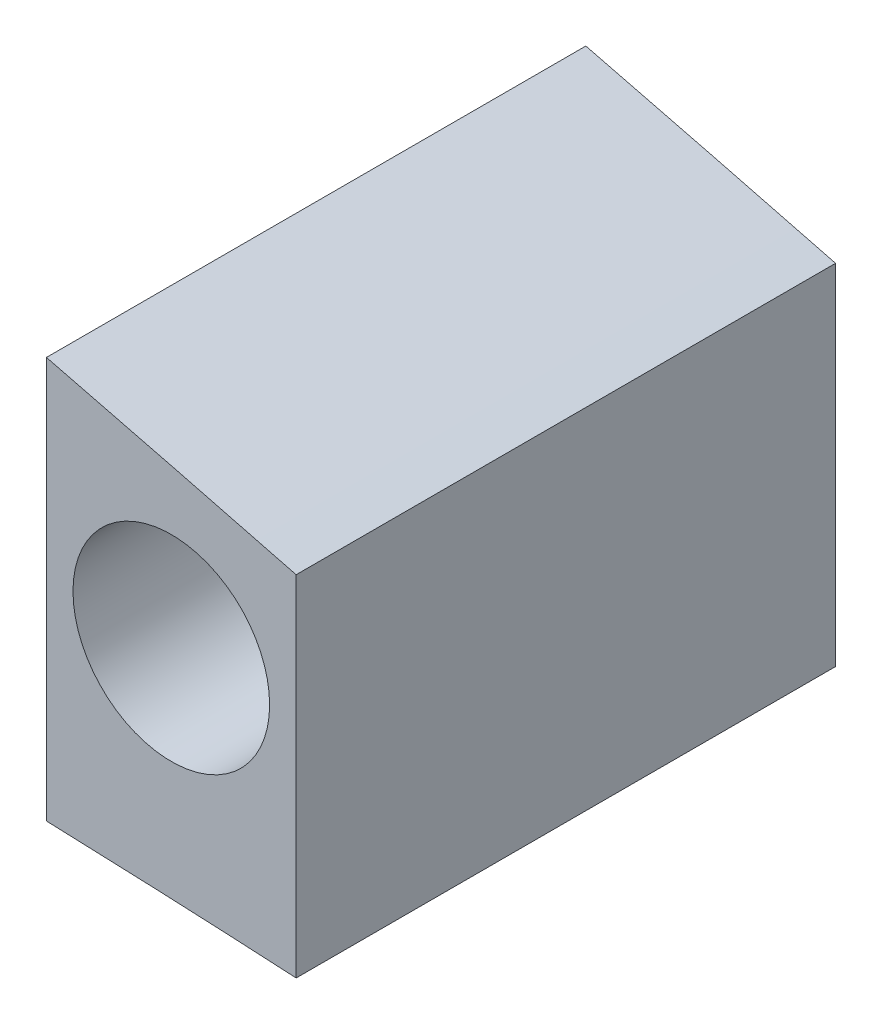
ISO-10303-21;
HEADER;
FILE_DESCRIPTION(('STEP AP214'),'2;1');
FILE_NAME('part.step','',(''),(''),'','','');
FILE_SCHEMA(('AUTOMOTIVE_DESIGN { 1 0 10303 214 1 1 1 1 }'));
ENDSEC;
DATA;
#1=APPLICATION_CONTEXT('core data for automotive mechanical design processes');
#2=APPLICATION_PROTOCOL_DEFINITION('international standard','automotive_design',2000,#1);
#3=PRODUCT_CONTEXT('',#1,'mechanical');
#4=PRODUCT('Part','Part','',(#3));
#5=PRODUCT_RELATED_PRODUCT_CATEGORY('part','',(#4));
#6=PRODUCT_DEFINITION_FORMATION('','',#4);
#7=PRODUCT_DEFINITION_CONTEXT('part definition',#1,'design');
#8=PRODUCT_DEFINITION('design','',#6,#7);
#9=PRODUCT_DEFINITION_SHAPE('','',#8);
#10=(LENGTH_UNIT() NAMED_UNIT(*) SI_UNIT(.MILLI.,.METRE.));
#11=(NAMED_UNIT(*) PLANE_ANGLE_UNIT() SI_UNIT($,.RADIAN.));
#12=(NAMED_UNIT(*) SI_UNIT($,.STERADIAN.) SOLID_ANGLE_UNIT());
#13=UNCERTAINTY_MEASURE_WITH_UNIT(LENGTH_MEASURE(1.E-05),#10,'distance_accuracy_value','');
#14=(GEOMETRIC_REPRESENTATION_CONTEXT(3) GLOBAL_UNCERTAINTY_ASSIGNED_CONTEXT((#13)) GLOBAL_UNIT_ASSIGNED_CONTEXT((#10,
#11,#12)) REPRESENTATION_CONTEXT('',''));
#15=CARTESIAN_POINT('',(0.,0.,0.));
#16=DIRECTION('',(0.,0.,1.));
#17=DIRECTION('',(1.,0.,0.));
#18=AXIS2_PLACEMENT_3D('',#15,#16,#17);
#19=CARTESIAN_POINT('',(0.000560351162113587,0.000130087070423624,27.432));
#20=CARTESIAN_POINT('',(1.23071418869678,-6.92407609127206,27.432));
#21=CARTESIAN_POINT('',(15.3166033306834,-6.18906584099094,27.432));
#22=CARTESIAN_POINT('',(36.4546728163185,-6.09849990105009,27.432));
#23=CARTESIAN_POINT('',(66.5061971849192,-0.586669106973501,27.432));
#24=CARTESIAN_POINT('',(110.497331171581,6.18149522271792,27.432));
#25=CARTESIAN_POINT('',(157.718638091679,9.03065014873911,27.432));
#26=CARTESIAN_POINT('',(205.10142463584,8.83808028186313,27.432));
#27=CARTESIAN_POINT('',(235.858814759408,7.87030619247826,27.432));
#28=CARTESIAN_POINT('',(260.846344817159,5.42741339404395,27.432));
#29=CARTESIAN_POINT('',(276.264022989737,4.51435670375389,27.432));
#30=CARTESIAN_POINT('',(293.989507544058,2.09398731346533,27.432));
#31=CARTESIAN_POINT('',(303.956832564589,1.47095520994628,27.432));
#32=CARTESIAN_POINT('',(309.846313894505,0.000130087070423666,27.432));
#33=B_SPLINE_CURVE_WITH_KNOTS('',3,(#19,#20,#21,#22,#23,#24,#25,#26,#27,#28,#29,#30,#31,#32),
.UNSPECIFIED.,.F.,.F.,(4,1,1,1,1,1,1,1,1,1,1,4),(0.,0.0569078595717698,0.106482711504673,
0.214488052979465,0.341297688349143,0.535095665520157,0.664680853556909,0.794660698192775,
0.828978881532905,0.904725108725214,0.942212919019968,1.),.UNSPECIFIED.);
#34=DIRECTION('',(0.,0.,-1.));
#35=VECTOR('',#34,1.);
#36=SURFACE_OF_LINEAR_EXTRUSION('',#33,#35);
#37=CARTESIAN_POINT('',(220.946313894505,8.2551988143819,27.432));
#38=VERTEX_POINT('',#37);
#39=CARTESIAN_POINT('',(233.646313894505,7.69052977146896,27.432));
#40=VERTEX_POINT('',#39);
#41=EDGE_CURVE('E86',#38,#40,#33,.T.);
#42=ORIENTED_EDGE('',*,*,#41,.F.);
#43=DIRECTION('',(0.,0.,-1.));
#44=VECTOR('',#43,1.);
#45=CARTESIAN_POINT('',(220.946313894505,8.25519881439546,27.432));
#46=LINE('',#45,#44);
#47=CARTESIAN_POINT('',(220.946313894505,8.2551988143819,0.));
#48=VERTEX_POINT('',#47);
#49=EDGE_CURVE('E74',#38,#48,#46,.T.);
#50=ORIENTED_EDGE('',*,*,#49,.T.);
#51=CARTESIAN_POINT('',(0.000560351162113587,0.000130087070423624,0.));
#52=CARTESIAN_POINT('',(1.23071418869678,-6.92407609127206,0.));
#53=CARTESIAN_POINT('',(15.3166033306834,-6.18906584099094,0.));
#54=CARTESIAN_POINT('',(36.4546728163185,-6.09849990105009,0.));
#55=CARTESIAN_POINT('',(66.5061971849192,-0.586669106973501,0.));
#56=CARTESIAN_POINT('',(110.497331171581,6.18149522271792,0.));
#57=CARTESIAN_POINT('',(157.718638091679,9.03065014873911,0.));
#58=CARTESIAN_POINT('',(205.10142463584,8.83808028186313,0.));
#59=CARTESIAN_POINT('',(235.858814759408,7.87030619247826,0.));
#60=CARTESIAN_POINT('',(260.846344817159,5.42741339404395,0.));
#61=CARTESIAN_POINT('',(276.264022989737,4.51435670375389,0.));
#62=CARTESIAN_POINT('',(293.989507544058,2.09398731346533,0.));
#63=CARTESIAN_POINT('',(303.956832564589,1.47095520994628,0.));
#64=CARTESIAN_POINT('',(309.846313894505,0.000130087070423666,0.));
#65=B_SPLINE_CURVE_WITH_KNOTS('',3,(#51,#52,#53,#54,#55,#56,#57,#58,#59,#60,#61,#62,#63,#64),
.UNSPECIFIED.,.F.,.F.,(4,1,1,1,1,1,1,1,1,1,1,4),(0.,0.0569078595717698,0.106482711504673,
0.214488052979465,0.341297688349143,0.535095665520157,0.664680853556909,0.794660698192775,
0.828978881532905,0.904725108725214,0.942212919019968,1.),.UNSPECIFIED.);
#66=CARTESIAN_POINT('',(233.646313884782,7.69052977146896,0.));
#67=VERTEX_POINT('',#66);
#68=EDGE_CURVE('E58',#48,#67,#65,.T.);
#69=ORIENTED_EDGE('',*,*,#68,.T.);
#70=DIRECTION('',(0.,0.,-1.));
#71=VECTOR('',#70,1.);
#72=CARTESIAN_POINT('',(233.646313894505,7.69052977092525,27.432));
#73=LINE('',#72,#71);
#74=EDGE_CURVE('E90',#67,#40,#73,.F.);
#75=ORIENTED_EDGE('',*,*,#74,.T.);
#76=EDGE_LOOP('',(#42,#50,#69,#75));
#77=FACE_BOUND('',#76,.T.);
#78=ADVANCED_FACE('F35',(#77),#36,.F.);
#79=CARTESIAN_POINT('',(309.846313894505,0.000130087070423864,27.432));
#80=CARTESIAN_POINT('',(314.816918223261,-0.51620674157964,27.432));
#81=CARTESIAN_POINT('',(301.273197720551,4.38282813873556,27.432));
#82=CARTESIAN_POINT('',(290.359837670022,8.71099439045776,27.432));
#83=CARTESIAN_POINT('',(256.952064400645,19.5289209482833,27.432));
#84=CARTESIAN_POINT('',(217.961060472083,29.6129748944238,27.432));
#85=CARTESIAN_POINT('',(173.256699242147,40.0411042779434,27.432));
#86=CARTESIAN_POINT('',(131.400792108858,47.8848319151037,27.432));
#87=CARTESIAN_POINT('',(89.5976184754884,49.290763053775,27.432));
#88=CARTESIAN_POINT('',(52.1111282710831,42.0692152748914,27.432));
#89=CARTESIAN_POINT('',(26.2867198183782,29.9751763284633,27.432));
#90=CARTESIAN_POINT('',(8.64909202481883,17.8566051741579,27.432));
#91=CARTESIAN_POINT('',(0.810633126632263,7.35919605469637,27.432));
#92=CARTESIAN_POINT('',(0.000560351162116727,0.000130087070423829,27.432));
#93=B_SPLINE_CURVE_WITH_KNOTS('',3,(#79,#80,#81,#82,#83,#84,#85,#86,#87,#88,#89,#90,#91,#92),
.UNSPECIFIED.,.F.,.F.,(4,1,1,1,1,1,1,1,1,1,1,4),(0.,0.0239417713693992,0.070244030177139,
0.147561721425381,0.308455887006792,0.442387865106874,0.551517565626309,0.687091076796298,
0.811391258419108,0.886311735305172,0.939136382225768,1.),.UNSPECIFIED.);
#94=DIRECTION('',(0.,0.,-1.));
#95=VECTOR('',#94,1.);
#96=SURFACE_OF_LINEAR_EXTRUSION('',#93,#95);
#97=CARTESIAN_POINT('',(309.846313894505,0.000130087070423864,0.));
#98=CARTESIAN_POINT('',(314.816918223261,-0.51620674157964,0.));
#99=CARTESIAN_POINT('',(301.273197720551,4.38282813873556,0.));
#100=CARTESIAN_POINT('',(290.359837670022,8.71099439045776,0.));
#101=CARTESIAN_POINT('',(256.952064400645,19.5289209482833,0.));
#102=CARTESIAN_POINT('',(217.961060472083,29.6129748944238,0.));
#103=CARTESIAN_POINT('',(173.256699242147,40.0411042779434,0.));
#104=CARTESIAN_POINT('',(131.400792108858,47.8848319151037,0.));
#105=CARTESIAN_POINT('',(89.5976184754884,49.290763053775,0.));
#106=CARTESIAN_POINT('',(52.1111282710831,42.0692152748914,0.));
#107=CARTESIAN_POINT('',(26.2867198183782,29.9751763284633,0.));
#108=CARTESIAN_POINT('',(8.64909202481883,17.8566051741579,0.));
#109=CARTESIAN_POINT('',(0.810633126632263,7.35919605469637,0.));
#110=CARTESIAN_POINT('',(0.000560351162116727,0.000130087070423829,0.));
#111=B_SPLINE_CURVE_WITH_KNOTS('',3,(#97,#98,#99,#100,#101,#102,#103,#104,#105,#106,#107,#108,
#109,#110),.UNSPECIFIED.,.F.,.F.,(4,1,1,1,1,1,1,1,1,1,1,4),(0.,0.0239417713693992,
0.070244030177139,0.147561721425381,0.308455887006792,0.442387865106874,0.551517565626309,
0.687091076796298,0.811391258419108,0.886311735305172,0.939136382225768,1.),.UNSPECIFIED.);
#112=CARTESIAN_POINT('',(233.646313894505,25.4527523915985,0.));
#113=VERTEX_POINT('',#112);
#114=CARTESIAN_POINT('',(220.946313894505,28.6725157585964,0.));
#115=VERTEX_POINT('',#114);
#116=EDGE_CURVE('E91',#113,#115,#111,.T.);
#117=ORIENTED_EDGE('',*,*,#116,.T.);
#118=DIRECTION('',(0.,0.,-1.));
#119=VECTOR('',#118,1.);
#120=CARTESIAN_POINT('',(220.946313894505,28.6725157585964,27.432));
#121=LINE('',#120,#119);
#122=CARTESIAN_POINT('',(220.946313894505,28.6725157585964,27.432));
#123=VERTEX_POINT('',#122);
#124=EDGE_CURVE('E50',#115,#123,#121,.F.);
#125=ORIENTED_EDGE('',*,*,#124,.T.);
#126=CARTESIAN_POINT('',(233.646313894505,25.4527523915985,27.432));
#127=VERTEX_POINT('',#126);
#128=EDGE_CURVE('E43',#127,#123,#93,.T.);
#129=ORIENTED_EDGE('',*,*,#128,.F.);
#130=DIRECTION('',(0.,0.,-1.));
#131=VECTOR('',#130,1.);
#132=CARTESIAN_POINT('',(233.646313894505,25.4527523940641,27.432));
#133=LINE('',#132,#131);
#134=EDGE_CURVE('E182',#127,#113,#133,.T.);
#135=ORIENTED_EDGE('',*,*,#134,.T.);
#136=EDGE_LOOP('',(#117,#125,#129,#135));
#137=FACE_BOUND('',#136,.T.);
#138=ADVANCED_FACE('F111',(#137),#96,.F.);
#139=CARTESIAN_POINT('',(153.387816973495,8.33338198857885,27.432));
#140=DIRECTION('',(0.,0.,-1.));
#141=DIRECTION('',(-1.,0.,0.));
#142=AXIS2_PLACEMENT_3D('',#139,#140,#141);
#143=PLANE('',#142);
#144=CARTESIAN_POINT('',(227.296313894505,19.0501300870704,27.432));
#145=DIRECTION('',(0.,0.,1.));
#146=DIRECTION('',(1.,0.,0.));
#147=AXIS2_PLACEMENT_3D('',#144,#145,#146);
#148=CIRCLE('',#147,4.99999999999999);
#149=CARTESIAN_POINT('',(232.296313894505,19.0501300870704,27.432));
#150=VERTEX_POINT('',#149);
#151=EDGE_CURVE('E180',#150,#150,#148,.T.);
#152=ORIENTED_EDGE('',*,*,#151,.F.);
#153=EDGE_LOOP('',(#152));
#154=FACE_BOUND('',#153,.T.);
#155=ORIENTED_EDGE('',*,*,#128,.T.);
#156=DIRECTION('',(0.,1.,0.));
#157=VECTOR('',#156,1.);
#158=CARTESIAN_POINT('',(220.946313894505,80.4351700103236,27.432));
#159=LINE('',#158,#157);
#160=EDGE_CURVE('E77',#38,#123,#159,.T.);
#161=ORIENTED_EDGE('',*,*,#160,.F.);
#162=ORIENTED_EDGE('',*,*,#41,.T.);
#163=DIRECTION('',(0.,-1.,0.));
#164=VECTOR('',#163,1.);
#165=CARTESIAN_POINT('',(233.646313894505,-48.3468699505748,27.432));
#166=LINE('',#165,#164);
#167=EDGE_CURVE('E80',#127,#40,#166,.T.);
#168=ORIENTED_EDGE('',*,*,#167,.F.);
#169=EDGE_LOOP('',(#155,#161,#162,#168));
#170=FACE_BOUND('',#169,.T.);
#171=ADVANCED_FACE('F84',(#154,#170),#143,.F.);
#172=CARTESIAN_POINT('',(153.387816973495,8.33338198857885,0.));
#173=DIRECTION('',(0.,0.,-1.));
#174=DIRECTION('',(-1.,0.,0.));
#175=AXIS2_PLACEMENT_3D('',#172,#173,#174);
#176=PLANE('',#175);
#177=DIRECTION('',(0.,1.,0.));
#178=VECTOR('',#177,1.);
#179=CARTESIAN_POINT('',(220.946313894505,80.4351700103236,0.));
#180=LINE('',#179,#178);
#181=EDGE_CURVE('E78',#48,#115,#180,.T.);
#182=ORIENTED_EDGE('',*,*,#181,.T.);
#183=ORIENTED_EDGE('',*,*,#116,.F.);
#184=DIRECTION('',(0.,1.,0.));
#185=VECTOR('',#184,1.);
#186=CARTESIAN_POINT('',(233.646313894505,8.33338198857885,0.));
#187=LINE('',#186,#185);
#188=EDGE_CURVE('E11',#67,#113,#187,.T.);
#189=ORIENTED_EDGE('',*,*,#188,.F.);
#190=ORIENTED_EDGE('',*,*,#68,.F.);
#191=EDGE_LOOP('',(#182,#183,#189,#190));
#192=FACE_BOUND('',#191,.T.);
#193=CARTESIAN_POINT('',(227.296313894505,19.0501300870704,0.));
#194=DIRECTION('',(0.,0.,1.));
#195=DIRECTION('',(1.,0.,0.));
#196=AXIS2_PLACEMENT_3D('',#193,#194,#195);
#197=CIRCLE('',#196,4.99999999999999);
#198=CARTESIAN_POINT('',(232.296313894505,19.0501300870704,0.));
#199=VERTEX_POINT('',#198);
#200=EDGE_CURVE('E177',#199,#199,#197,.T.);
#201=ORIENTED_EDGE('',*,*,#200,.T.);
#202=EDGE_LOOP('',(#201));
#203=FACE_BOUND('',#202,.T.);
#204=ADVANCED_FACE('F115',(#192,#203),#176,.T.);
#205=CARTESIAN_POINT('',(233.646313894505,-48.3468699505748,0.));
#206=DIRECTION('',(-1.,0.,0.));
#207=DIRECTION('',(0.,0.,1.));
#208=AXIS2_PLACEMENT_3D('',#205,#206,#207);
#209=PLANE('',#208);
#210=ORIENTED_EDGE('',*,*,#188,.T.);
#211=ORIENTED_EDGE('',*,*,#134,.F.);
#212=ORIENTED_EDGE('',*,*,#167,.T.);
#213=ORIENTED_EDGE('',*,*,#74,.F.);
#214=EDGE_LOOP('',(#210,#211,#212,#213));
#215=FACE_BOUND('',#214,.T.);
#216=ADVANCED_FACE('F118',(#215),#209,.F.);
#217=CARTESIAN_POINT('',(227.296313894505,19.0501300870704,0.));
#218=DIRECTION('',(0.,0.,1.));
#219=DIRECTION('',(1.,0.,0.));
#220=AXIS2_PLACEMENT_3D('',#217,#218,#219);
#221=CYLINDRICAL_SURFACE('',#220,4.99999999999999);
#222=ORIENTED_EDGE('',*,*,#200,.F.);
#223=EDGE_LOOP('',(#222));
#224=FACE_BOUND('',#223,.T.);
#225=ORIENTED_EDGE('',*,*,#151,.T.);
#226=EDGE_LOOP('',(#225));
#227=FACE_BOUND('',#226,.T.);
#228=ADVANCED_FACE('F125',(#224,#227),#221,.F.);
#229=CARTESIAN_POINT('',(220.946313894505,80.4351700103236,0.));
#230=DIRECTION('',(1.,0.,0.));
#231=DIRECTION('',(0.,1.,0.));
#232=AXIS2_PLACEMENT_3D('',#229,#230,#231);
#233=PLANE('',#232);
#234=ORIENTED_EDGE('',*,*,#160,.T.);
#235=ORIENTED_EDGE('',*,*,#124,.F.);
#236=ORIENTED_EDGE('',*,*,#181,.F.);
#237=ORIENTED_EDGE('',*,*,#49,.F.);
#238=EDGE_LOOP('',(#234,#235,#236,#237));
#239=FACE_BOUND('',#238,.T.);
#240=ADVANCED_FACE('F76',(#239),#233,.F.);
#241=CLOSED_SHELL('',(#78,#138,#171,#204,#216,#228,#240));
#242=MANIFOLD_SOLID_BREP('B2',#241);
#243=ADVANCED_BREP_SHAPE_REPRESENTATION('',(#18,#242),#14);
#244=SHAPE_DEFINITION_REPRESENTATION(#9,#243);
ENDSEC;
END-ISO-10303-21;
